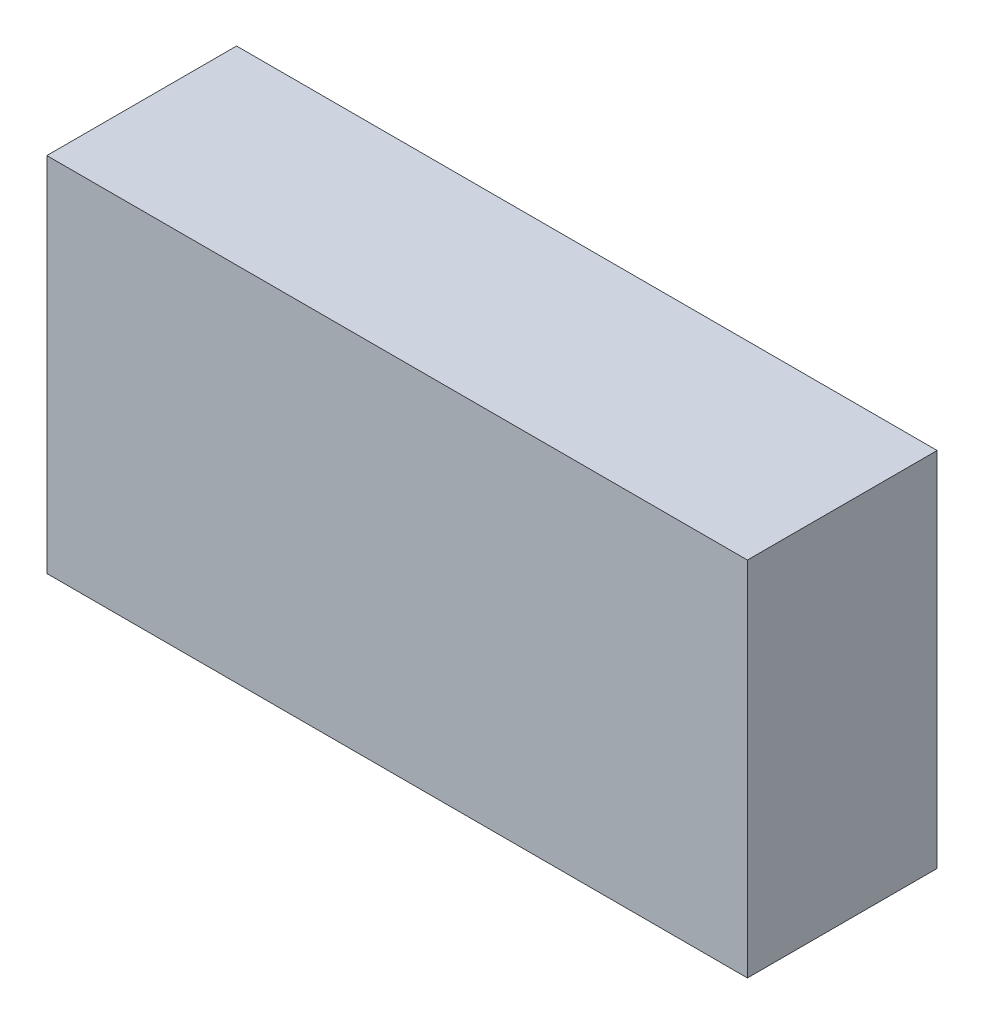
ISO-10303-21;
HEADER;
FILE_DESCRIPTION(('STEP AP214'),'2;1');
FILE_NAME('part.step','',(''),(''),'','','');
FILE_SCHEMA(('AUTOMOTIVE_DESIGN { 1 0 10303 214 1 1 1 1 }'));
ENDSEC;
DATA;
#1=APPLICATION_CONTEXT('core data for automotive mechanical design processes');
#2=APPLICATION_PROTOCOL_DEFINITION('international standard','automotive_design',2000,#1);
#3=PRODUCT_CONTEXT('',#1,'mechanical');
#4=PRODUCT('Part','Part','',(#3));
#5=PRODUCT_RELATED_PRODUCT_CATEGORY('part','',(#4));
#6=PRODUCT_DEFINITION_FORMATION('','',#4);
#7=PRODUCT_DEFINITION_CONTEXT('part definition',#1,'design');
#8=PRODUCT_DEFINITION('design','',#6,#7);
#9=PRODUCT_DEFINITION_SHAPE('','',#8);
#10=(LENGTH_UNIT() NAMED_UNIT(*) SI_UNIT(.MILLI.,.METRE.));
#11=(NAMED_UNIT(*) PLANE_ANGLE_UNIT() SI_UNIT($,.RADIAN.));
#12=(NAMED_UNIT(*) SI_UNIT($,.STERADIAN.) SOLID_ANGLE_UNIT());
#13=UNCERTAINTY_MEASURE_WITH_UNIT(LENGTH_MEASURE(1.E-05),#10,'distance_accuracy_value','');
#14=(GEOMETRIC_REPRESENTATION_CONTEXT(3) GLOBAL_UNCERTAINTY_ASSIGNED_CONTEXT((#13)) GLOBAL_UNIT_ASSIGNED_CONTEXT((#10,
#11,#12)) REPRESENTATION_CONTEXT('',''));
#15=CARTESIAN_POINT('',(0.,0.,0.));
#16=DIRECTION('',(0.,0.,1.));
#17=DIRECTION('',(1.,0.,0.));
#18=AXIS2_PLACEMENT_3D('',#15,#16,#17);
#19=CARTESIAN_POINT('',(-57.1794871794872,75.5128205128206,65.));
#20=DIRECTION('',(1.,0.,0.));
#21=DIRECTION('',(0.,1.,0.));
#22=AXIS2_PLACEMENT_3D('',#19,#20,#21);
#23=PLANE('',#22);
#24=DIRECTION('',(0.,-1.,0.));
#25=VECTOR('',#24,1.);
#26=CARTESIAN_POINT('',(-57.1794871794872,75.5128205128206,0.));
#27=LINE('',#26,#25);
#28=CARTESIAN_POINT('',(-57.1794871794872,75.5128205128206,0.));
#29=VERTEX_POINT('',#28);
#30=CARTESIAN_POINT('',(-57.1794871794871,-48.4871794871794,0.));
#31=VERTEX_POINT('',#30);
#32=EDGE_CURVE('E107',#29,#31,#27,.T.);
#33=ORIENTED_EDGE('',*,*,#32,.T.);
#34=DIRECTION('',(0.,0.,-1.));
#35=VECTOR('',#34,1.);
#36=CARTESIAN_POINT('',(-57.1794871794871,-48.4871794871794,65.));
#37=LINE('',#36,#35);
#38=CARTESIAN_POINT('',(-57.1794871794871,-48.4871794871794,65.));
#39=VERTEX_POINT('',#38);
#40=EDGE_CURVE('E11',#39,#31,#37,.T.);
#41=ORIENTED_EDGE('',*,*,#40,.F.);
#42=DIRECTION('',(0.,-1.,0.));
#43=VECTOR('',#42,1.);
#44=CARTESIAN_POINT('',(-57.1794871794872,75.5128205128206,65.));
#45=LINE('',#44,#43);
#46=CARTESIAN_POINT('',(-57.1794871794872,75.5128205128206,65.));
#47=VERTEX_POINT('',#46);
#48=EDGE_CURVE('E91',#47,#39,#45,.T.);
#49=ORIENTED_EDGE('',*,*,#48,.F.);
#50=DIRECTION('',(0.,0.,-1.));
#51=VECTOR('',#50,1.);
#52=CARTESIAN_POINT('',(-57.1794871794872,75.5128205128206,65.));
#53=LINE('',#52,#51);
#54=EDGE_CURVE('E103',#47,#29,#53,.T.);
#55=ORIENTED_EDGE('',*,*,#54,.T.);
#56=EDGE_LOOP('',(#33,#41,#49,#55));
#57=FACE_BOUND('',#56,.T.);
#58=ADVANCED_FACE('F39',(#57),#23,.F.);
#59=CARTESIAN_POINT('',(-57.1794871794871,-48.4871794871794,65.));
#60=DIRECTION('',(0.,1.,0.));
#61=DIRECTION('',(0.,0.,1.));
#62=AXIS2_PLACEMENT_3D('',#59,#60,#61);
#63=PLANE('',#62);
#64=DIRECTION('',(1.,0.,0.));
#65=VECTOR('',#64,1.);
#66=CARTESIAN_POINT('',(-57.1794871794871,-48.4871794871794,0.));
#67=LINE('',#66,#65);
#68=CARTESIAN_POINT('',(182.820512820513,-48.4871794871794,0.));
#69=VERTEX_POINT('',#68);
#70=EDGE_CURVE('E96',#31,#69,#67,.T.);
#71=ORIENTED_EDGE('',*,*,#70,.T.);
#72=DIRECTION('',(0.,0.,-1.));
#73=VECTOR('',#72,1.);
#74=CARTESIAN_POINT('',(182.820512820513,-48.4871794871794,65.));
#75=LINE('',#74,#73);
#76=CARTESIAN_POINT('',(182.820512820513,-48.4871794871794,65.));
#77=VERTEX_POINT('',#76);
#78=EDGE_CURVE('E48',#77,#69,#75,.T.);
#79=ORIENTED_EDGE('',*,*,#78,.F.);
#80=DIRECTION('',(1.,0.,0.));
#81=VECTOR('',#80,1.);
#82=CARTESIAN_POINT('',(-57.1794871794871,-48.4871794871794,65.));
#83=LINE('',#82,#81);
#84=EDGE_CURVE('E86',#39,#77,#83,.T.);
#85=ORIENTED_EDGE('',*,*,#84,.F.);
#86=ORIENTED_EDGE('',*,*,#40,.T.);
#87=EDGE_LOOP('',(#71,#79,#85,#86));
#88=FACE_BOUND('',#87,.T.);
#89=ADVANCED_FACE('F95',(#88),#63,.F.);
#90=CARTESIAN_POINT('',(182.820512820513,75.5128205128206,65.));
#91=DIRECTION('',(-1.,0.,0.));
#92=DIRECTION('',(0.,0.,1.));
#93=AXIS2_PLACEMENT_3D('',#90,#91,#92);
#94=PLANE('',#93);
#95=DIRECTION('',(0.,1.,0.));
#96=VECTOR('',#95,1.);
#97=CARTESIAN_POINT('',(182.820512820513,75.5128205128206,0.));
#98=LINE('',#97,#96);
#99=CARTESIAN_POINT('',(182.820512820513,75.5128205128206,0.));
#100=VERTEX_POINT('',#99);
#101=EDGE_CURVE('E73',#69,#100,#98,.T.);
#102=ORIENTED_EDGE('',*,*,#101,.T.);
#103=DIRECTION('',(0.,0.,-1.));
#104=VECTOR('',#103,1.);
#105=CARTESIAN_POINT('',(182.820512820513,75.5128205128206,65.));
#106=LINE('',#105,#104);
#107=CARTESIAN_POINT('',(182.820512820513,75.5128205128206,65.));
#108=VERTEX_POINT('',#107);
#109=EDGE_CURVE('E98',#108,#100,#106,.T.);
#110=ORIENTED_EDGE('',*,*,#109,.F.);
#111=DIRECTION('',(0.,1.,0.));
#112=VECTOR('',#111,1.);
#113=CARTESIAN_POINT('',(182.820512820513,75.5128205128206,65.));
#114=LINE('',#113,#112);
#115=EDGE_CURVE('E89',#77,#108,#114,.T.);
#116=ORIENTED_EDGE('',*,*,#115,.F.);
#117=ORIENTED_EDGE('',*,*,#78,.T.);
#118=EDGE_LOOP('',(#102,#110,#116,#117));
#119=FACE_BOUND('',#118,.T.);
#120=ADVANCED_FACE('F99',(#119),#94,.F.);
#121=CARTESIAN_POINT('',(-57.1794871794872,75.5128205128206,65.));
#122=DIRECTION('',(0.,-1.,0.));
#123=DIRECTION('',(0.,0.,-1.));
#124=AXIS2_PLACEMENT_3D('',#121,#122,#123);
#125=PLANE('',#124);
#126=DIRECTION('',(-1.,0.,0.));
#127=VECTOR('',#126,1.);
#128=CARTESIAN_POINT('',(-57.1794871794872,75.5128205128206,0.));
#129=LINE('',#128,#127);
#130=EDGE_CURVE('E79',#100,#29,#129,.T.);
#131=ORIENTED_EDGE('',*,*,#130,.T.);
#132=ORIENTED_EDGE('',*,*,#54,.F.);
#133=DIRECTION('',(-1.,0.,0.));
#134=VECTOR('',#133,1.);
#135=CARTESIAN_POINT('',(-57.1794871794872,75.5128205128206,65.));
#136=LINE('',#135,#134);
#137=EDGE_CURVE('E56',#108,#47,#136,.T.);
#138=ORIENTED_EDGE('',*,*,#137,.F.);
#139=ORIENTED_EDGE('',*,*,#109,.T.);
#140=EDGE_LOOP('',(#131,#132,#138,#139));
#141=FACE_BOUND('',#140,.T.);
#142=ADVANCED_FACE('F120',(#141),#125,.F.);
#143=CARTESIAN_POINT('',(0.,0.,65.));
#144=DIRECTION('',(0.,0.,1.));
#145=DIRECTION('',(1.,0.,0.));
#146=AXIS2_PLACEMENT_3D('',#143,#144,#145);
#147=PLANE('',#146);
#148=ORIENTED_EDGE('',*,*,#48,.T.);
#149=ORIENTED_EDGE('',*,*,#84,.T.);
#150=ORIENTED_EDGE('',*,*,#115,.T.);
#151=ORIENTED_EDGE('',*,*,#137,.T.);
#152=EDGE_LOOP('',(#148,#149,#150,#151));
#153=FACE_BOUND('',#152,.T.);
#154=ADVANCED_FACE('F87',(#153),#147,.T.);
#155=CARTESIAN_POINT('',(0.,0.,0.));
#156=DIRECTION('',(0.,0.,1.));
#157=DIRECTION('',(1.,0.,0.));
#158=AXIS2_PLACEMENT_3D('',#155,#156,#157);
#159=PLANE('',#158);
#160=ORIENTED_EDGE('',*,*,#32,.F.);
#161=ORIENTED_EDGE('',*,*,#130,.F.);
#162=ORIENTED_EDGE('',*,*,#101,.F.);
#163=ORIENTED_EDGE('',*,*,#70,.F.);
#164=EDGE_LOOP('',(#160,#161,#162,#163));
#165=FACE_BOUND('',#164,.T.);
#166=ADVANCED_FACE('F123',(#165),#159,.F.);
#167=CLOSED_SHELL('',(#58,#89,#120,#142,#154,#166));
#168=MANIFOLD_SOLID_BREP('B2',#167);
#169=ADVANCED_BREP_SHAPE_REPRESENTATION('',(#18,#168),#14);
#170=SHAPE_DEFINITION_REPRESENTATION(#9,#169);
ENDSEC;
END-ISO-10303-21;
